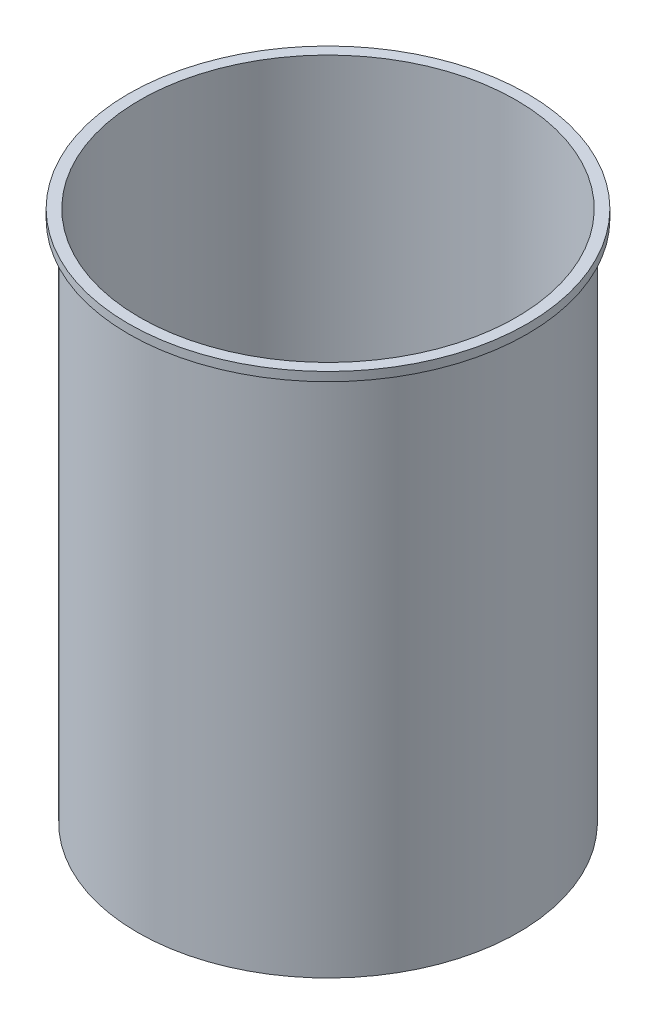
ISO-10303-21;
HEADER;
FILE_DESCRIPTION(('STEP AP214'),'2;1');
FILE_NAME('part.step','',(''),(''),'','','');
FILE_SCHEMA(('AUTOMOTIVE_DESIGN { 1 0 10303 214 1 1 1 1 }'));
ENDSEC;
DATA;
#1=APPLICATION_CONTEXT('core data for automotive mechanical design processes');
#2=APPLICATION_PROTOCOL_DEFINITION('international standard','automotive_design',2000,#1);
#3=PRODUCT_CONTEXT('',#1,'mechanical');
#4=PRODUCT('Part','Part','',(#3));
#5=PRODUCT_RELATED_PRODUCT_CATEGORY('part','',(#4));
#6=PRODUCT_DEFINITION_FORMATION('','',#4);
#7=PRODUCT_DEFINITION_CONTEXT('part definition',#1,'design');
#8=PRODUCT_DEFINITION('design','',#6,#7);
#9=PRODUCT_DEFINITION_SHAPE('','',#8);
#10=(LENGTH_UNIT() NAMED_UNIT(*) SI_UNIT(.MILLI.,.METRE.));
#11=(NAMED_UNIT(*) PLANE_ANGLE_UNIT() SI_UNIT($,.RADIAN.));
#12=(NAMED_UNIT(*) SI_UNIT($,.STERADIAN.) SOLID_ANGLE_UNIT());
#13=UNCERTAINTY_MEASURE_WITH_UNIT(LENGTH_MEASURE(1.E-05),#10,'distance_accuracy_value','');
#14=(GEOMETRIC_REPRESENTATION_CONTEXT(3) GLOBAL_UNCERTAINTY_ASSIGNED_CONTEXT((#13)) GLOBAL_UNIT_ASSIGNED_CONTEXT((#10,
#11,#12)) REPRESENTATION_CONTEXT('',''));
#15=CARTESIAN_POINT('',(0.,0.,0.));
#16=DIRECTION('',(0.,0.,1.));
#17=DIRECTION('',(1.,0.,0.));
#18=AXIS2_PLACEMENT_3D('',#15,#16,#17);
#19=CARTESIAN_POINT('',(0.,0.,0.));
#20=DIRECTION('',(0.,1.,0.));
#21=DIRECTION('',(0.,0.,1.));
#22=AXIS2_PLACEMENT_3D('',#19,#20,#21);
#23=PLANE('',#22);
#24=CARTESIAN_POINT('',(0.,0.,0.));
#25=DIRECTION('',(0.,1.,0.));
#26=DIRECTION('',(0.,0.,1.));
#27=AXIS2_PLACEMENT_3D('',#24,#25,#26);
#28=CIRCLE('',#27,43.);
#29=CARTESIAN_POINT('',(0.,0.,43.));
#30=VERTEX_POINT('',#29);
#31=EDGE_CURVE('E41',#30,#30,#28,.T.);
#32=ORIENTED_EDGE('',*,*,#31,.F.);
#33=EDGE_LOOP('',(#32));
#34=FACE_BOUND('',#33,.T.);
#35=CARTESIAN_POINT('',(0.,0.,0.));
#36=DIRECTION('',(0.,1.,0.));
#37=DIRECTION('',(0.,0.,1.));
#38=AXIS2_PLACEMENT_3D('',#35,#36,#37);
#39=CIRCLE('',#38,42.5);
#40=CARTESIAN_POINT('',(0.,0.,42.5));
#41=VERTEX_POINT('',#40);
#42=EDGE_CURVE('E50',#41,#41,#39,.T.);
#43=ORIENTED_EDGE('',*,*,#42,.T.);
#44=EDGE_LOOP('',(#43));
#45=FACE_BOUND('',#44,.T.);
#46=ADVANCED_FACE('F37',(#34,#45),#23,.F.);
#47=CARTESIAN_POINT('',(0.,118.,0.));
#48=DIRECTION('',(0.,-1.,0.));
#49=DIRECTION('',(0.,0.,-1.));
#50=AXIS2_PLACEMENT_3D('',#47,#48,#49);
#51=CYLINDRICAL_SURFACE('',#50,43.);
#52=CARTESIAN_POINT('',(0.,118.,0.));
#53=DIRECTION('',(0.,1.,0.));
#54=DIRECTION('',(0.,0.,1.));
#55=AXIS2_PLACEMENT_3D('',#52,#53,#54);
#56=CIRCLE('',#55,43.);
#57=CARTESIAN_POINT('',(0.,118.,43.));
#58=VERTEX_POINT('',#57);
#59=EDGE_CURVE('E10',#58,#58,#56,.T.);
#60=ORIENTED_EDGE('',*,*,#59,.F.);
#61=EDGE_LOOP('',(#60));
#62=FACE_BOUND('',#61,.T.);
#63=ORIENTED_EDGE('',*,*,#31,.T.);
#64=EDGE_LOOP('',(#63));
#65=FACE_BOUND('',#64,.T.);
#66=ADVANCED_FACE('F39',(#62,#65),#51,.T.);
#67=CARTESIAN_POINT('',(0.,118.,0.));
#68=DIRECTION('',(0.,-1.,0.));
#69=DIRECTION('',(0.,0.,-1.));
#70=AXIS2_PLACEMENT_3D('',#67,#68,#69);
#71=CYLINDRICAL_SURFACE('',#70,42.5);
#72=ORIENTED_EDGE('',*,*,#42,.F.);
#73=EDGE_LOOP('',(#72));
#74=FACE_BOUND('',#73,.T.);
#75=CARTESIAN_POINT('',(0.,120.,0.));
#76=DIRECTION('',(0.,1.,0.));
#77=DIRECTION('',(0.,0.,1.));
#78=AXIS2_PLACEMENT_3D('',#75,#76,#77);
#79=CIRCLE('',#78,42.5);
#80=CARTESIAN_POINT('',(0.,120.,42.5));
#81=VERTEX_POINT('',#80);
#82=EDGE_CURVE('E60',#81,#81,#79,.T.);
#83=ORIENTED_EDGE('',*,*,#82,.T.);
#84=EDGE_LOOP('',(#83));
#85=FACE_BOUND('',#84,.T.);
#86=ADVANCED_FACE('F68',(#74,#85),#71,.F.);
#87=CARTESIAN_POINT('',(0.,120.,0.));
#88=DIRECTION('',(0.,1.,0.));
#89=DIRECTION('',(0.,0.,1.));
#90=AXIS2_PLACEMENT_3D('',#87,#88,#89);
#91=PLANE('',#90);
#92=CARTESIAN_POINT('',(0.,120.,0.));
#93=DIRECTION('',(0.,1.,0.));
#94=DIRECTION('',(0.,0.,1.));
#95=AXIS2_PLACEMENT_3D('',#92,#93,#94);
#96=CIRCLE('',#95,45.);
#97=CARTESIAN_POINT('',(0.,120.,45.));
#98=VERTEX_POINT('',#97);
#99=EDGE_CURVE('E55',#98,#98,#96,.T.);
#100=ORIENTED_EDGE('',*,*,#99,.T.);
#101=EDGE_LOOP('',(#100));
#102=FACE_BOUND('',#101,.T.);
#103=ORIENTED_EDGE('',*,*,#82,.F.);
#104=EDGE_LOOP('',(#103));
#105=FACE_BOUND('',#104,.T.);
#106=ADVANCED_FACE('F70',(#102,#105),#91,.T.);
#107=CARTESIAN_POINT('',(0.,118.,0.));
#108=DIRECTION('',(0.,1.,0.));
#109=DIRECTION('',(0.,0.,1.));
#110=AXIS2_PLACEMENT_3D('',#107,#108,#109);
#111=PLANE('',#110);
#112=ORIENTED_EDGE('',*,*,#59,.T.);
#113=EDGE_LOOP('',(#112));
#114=FACE_BOUND('',#113,.T.);
#115=CARTESIAN_POINT('',(0.,118.,0.));
#116=DIRECTION('',(0.,1.,0.));
#117=DIRECTION('',(0.,0.,1.));
#118=AXIS2_PLACEMENT_3D('',#115,#116,#117);
#119=CIRCLE('',#118,45.);
#120=CARTESIAN_POINT('',(0.,118.,45.));
#121=VERTEX_POINT('',#120);
#122=EDGE_CURVE('E56',#121,#121,#119,.T.);
#123=ORIENTED_EDGE('',*,*,#122,.F.);
#124=EDGE_LOOP('',(#123));
#125=FACE_BOUND('',#124,.T.);
#126=ADVANCED_FACE('F72',(#114,#125),#111,.F.);
#127=CARTESIAN_POINT('',(0.,120.,0.));
#128=DIRECTION('',(0.,-1.,0.));
#129=DIRECTION('',(0.,0.,-1.));
#130=AXIS2_PLACEMENT_3D('',#127,#128,#129);
#131=CYLINDRICAL_SURFACE('',#130,45.);
#132=ORIENTED_EDGE('',*,*,#99,.F.);
#133=EDGE_LOOP('',(#132));
#134=FACE_BOUND('',#133,.T.);
#135=ORIENTED_EDGE('',*,*,#122,.T.);
#136=EDGE_LOOP('',(#135));
#137=FACE_BOUND('',#136,.T.);
#138=ADVANCED_FACE('F79',(#134,#137),#131,.T.);
#139=CLOSED_SHELL('',(#46,#66,#86,#106,#126,#138));
#140=MANIFOLD_SOLID_BREP('B2',#139);
#141=ADVANCED_BREP_SHAPE_REPRESENTATION('',(#18,#140),#14);
#142=SHAPE_DEFINITION_REPRESENTATION(#9,#141);
ENDSEC;
END-ISO-10303-21;
